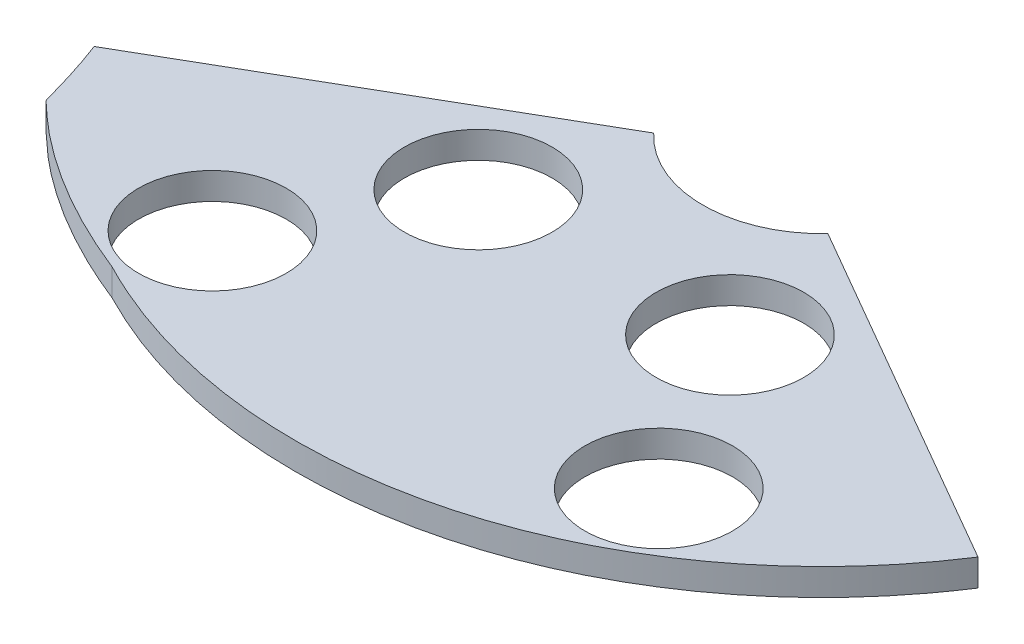
ISO-10303-21;
HEADER;
FILE_DESCRIPTION(('STEP AP214'),'2;1');
FILE_NAME('part.step','',(''),(''),'','','');
FILE_SCHEMA(('AUTOMOTIVE_DESIGN { 1 0 10303 214 1 1 1 1 }'));
ENDSEC;
DATA;
#1=APPLICATION_CONTEXT('core data for automotive mechanical design processes');
#2=APPLICATION_PROTOCOL_DEFINITION('international standard','automotive_design',2000,#1);
#3=PRODUCT_CONTEXT('',#1,'mechanical');
#4=PRODUCT('Part','Part','',(#3));
#5=PRODUCT_RELATED_PRODUCT_CATEGORY('part','',(#4));
#6=PRODUCT_DEFINITION_FORMATION('','',#4);
#7=PRODUCT_DEFINITION_CONTEXT('part definition',#1,'design');
#8=PRODUCT_DEFINITION('design','',#6,#7);
#9=PRODUCT_DEFINITION_SHAPE('','',#8);
#10=(LENGTH_UNIT() NAMED_UNIT(*) SI_UNIT(.MILLI.,.METRE.));
#11=(NAMED_UNIT(*) PLANE_ANGLE_UNIT() SI_UNIT($,.RADIAN.));
#12=(NAMED_UNIT(*) SI_UNIT($,.STERADIAN.) SOLID_ANGLE_UNIT());
#13=UNCERTAINTY_MEASURE_WITH_UNIT(LENGTH_MEASURE(1.E-05),#10,'distance_accuracy_value','');
#14=(GEOMETRIC_REPRESENTATION_CONTEXT(3) GLOBAL_UNCERTAINTY_ASSIGNED_CONTEXT((#13)) GLOBAL_UNIT_ASSIGNED_CONTEXT((#10,
#11,#12)) REPRESENTATION_CONTEXT('',''));
#15=CARTESIAN_POINT('',(0.,0.,0.));
#16=DIRECTION('',(0.,0.,1.));
#17=DIRECTION('',(1.,0.,0.));
#18=AXIS2_PLACEMENT_3D('',#15,#16,#17);
#19=CARTESIAN_POINT('',(0.,-123.736,0.));
#20=DIRECTION('',(0.,-1.,0.));
#21=DIRECTION('',(0.,0.,-1.));
#22=AXIS2_PLACEMENT_3D('',#19,#20,#21);
#23=PLANE('',#22);
#24=CARTESIAN_POINT('',(18.75,-123.736,32.476));
#25=DIRECTION('',(0.,-1.,0.));
#26=DIRECTION('',(0.,0.,-1.));
#27=AXIS2_PLACEMENT_3D('',#24,#25,#26);
#28=CIRCLE('',#27,10.999845998306);
#29=CARTESIAN_POINT('',(18.75,-123.736,21.476154001694));
#30=VERTEX_POINT('',#29);
#31=EDGE_CURVE('E253',#30,#30,#28,.T.);
#32=ORIENTED_EDGE('',*,*,#31,.F.);
#33=EDGE_LOOP('',(#32));
#34=FACE_BOUND('',#33,.T.);
#35=CARTESIAN_POINT('',(-33.25,-123.736,57.591));
#36=DIRECTION('',(0.,-1.,0.));
#37=DIRECTION('',(0.,0.,-1.));
#38=AXIS2_PLACEMENT_3D('',#35,#36,#37);
#39=CIRCLE('',#38,10.999845998306);
#40=CARTESIAN_POINT('',(-33.25,-123.736,46.591154001694));
#41=VERTEX_POINT('',#40);
#42=EDGE_CURVE('E160',#41,#41,#39,.T.);
#43=ORIENTED_EDGE('',*,*,#42,.F.);
#44=EDGE_LOOP('',(#43));
#45=FACE_BOUND('',#44,.T.);
#46=CARTESIAN_POINT('',(0.,-123.736,0.));
#47=DIRECTION('',(0.,1.,0.));
#48=DIRECTION('',(0.,0.,-1.));
#49=AXIS2_PLACEMENT_3D('',#46,#47,#48);
#50=CIRCLE('',#49,17.7501305084715);
#51=CARTESIAN_POINT('',(-12.9766531358799,-123.736,12.1108879302399));
#52=VERTEX_POINT('',#51);
#53=CARTESIAN_POINT('',(12.9766531358511,-123.736,12.1108879302707));
#54=VERTEX_POINT('',#53);
#55=EDGE_CURVE('E239',#52,#54,#50,.T.);
#56=ORIENTED_EDGE('',*,*,#55,.T.);
#57=DIRECTION('',(0.866025113442764,0.,0.500000502886195));
#58=VECTOR('',#57,1.);
#59=CARTESIAN_POINT('',(65.8946490574717,-123.736,42.6631480920525));
#60=LINE('',#59,#58);
#61=CARTESIAN_POINT('',(65.8946490574308,-123.736,42.6631480921157));
#62=VERTEX_POINT('',#61);
#63=EDGE_CURVE('E87',#54,#62,#60,.T.);
#64=ORIENTED_EDGE('',*,*,#63,.T.);
#65=CARTESIAN_POINT('',(-36.0665229319562,-123.736,69.7244372290524));
#66=CARTESIAN_POINT('',(-33.9263651647382,-123.736,70.8313229064624));
#67=CARTESIAN_POINT('',(-31.733770481213,-123.736,71.8398511649839));
#68=CARTESIAN_POINT('',(-27.2665982878309,-123.736,73.6519320144781));
#69=CARTESIAN_POINT('',(-24.9926269144818,-123.736,74.454603747582));
#70=CARTESIAN_POINT('',(-18.0716834468872,-123.736,76.5431271317146));
#71=CARTESIAN_POINT('',(-13.3281026231671,-123.736,77.5101685655605));
#72=CARTESIAN_POINT('',(-3.7462840567191,-123.736,78.5578587223858));
#73=CARTESIAN_POINT('',(1.09488051094354,-123.736,78.6398270020589));
#74=CARTESIAN_POINT('',(10.7057445200637,-123.736,77.9159109696359));
#75=CARTESIAN_POINT('',(15.4790771875439,-123.736,77.109522932305));
#76=CARTESIAN_POINT('',(24.7961822535566,-123.736,74.6368043425033));
#77=CARTESIAN_POINT('',(29.3418059334004,-123.736,72.9708446557198));
#78=CARTESIAN_POINT('',(35.8688225975578,-123.736,69.8675464746013));
#79=CARTESIAN_POINT('',(37.9990277904272,-123.736,68.7312628611845));
#80=CARTESIAN_POINT('',(42.1449660264491,-123.736,66.2711436137321));
#81=CARTESIAN_POINT('',(44.1586593832447,-123.736,64.9468560352647));
#82=CARTESIAN_POINT('',(50.009545434694,-123.736,60.6985787520622));
#83=CARTESIAN_POINT('',(53.6504488776382,-123.736,57.5081549449506));
#84=CARTESIAN_POINT('',(60.2830922387752,-123.736,50.513430512781));
#85=CARTESIAN_POINT('',(63.2752407093175,-123.736,46.7092688759202));
#86=CARTESIAN_POINT('',(65.8946490574308,-123.736,42.6631480921158));
#87=B_SPLINE_CURVE_WITH_KNOTS('',3,(#65,#66,#67,#68,#69,#70,#71,#72,#73,#74,#75,#76,#77,#78,#79,
#80,#81,#82,#83,#84,#85,#86),.UNSPECIFIED.,.F.,.F.,(4,2,2,2,2,2,2,2,2,2,4),
(6.50812737035267E-13,0.062503262884923,0.125003262884923,0.250003262884923,0.375003262884923,
0.500003262884923,0.625003262884923,0.687503262884923,0.750003262884923,0.875003262884923,
1.00000326288427),.UNSPECIFIED.);
#88=CARTESIAN_POINT('',(-36.0665229320546,-123.736,69.7244372290044));
#89=VERTEX_POINT('',#88);
#90=EDGE_CURVE('E102',#62,#89,#87,.F.);
#91=ORIENTED_EDGE('',*,*,#90,.T.);
#92=CARTESIAN_POINT('',(-62.4468616583492,-123.736,53.185552447563));
#93=CARTESIAN_POINT('',(-61.4901393919054,-123.736,54.0794734803377));
#94=CARTESIAN_POINT('',(-60.5319988250484,-123.736,54.9714544159299));
#95=CARTESIAN_POINT('',(-58.577666442625,-123.736,56.7033640663195));
#96=CARTESIAN_POINT('',(-57.5709386968218,-123.736,57.5288802486669));
#97=CARTESIAN_POINT('',(-55.5066131007295,-123.736,59.1103250015006));
#98=CARTESIAN_POINT('',(-54.4533348312587,-123.736,59.8721625300366));
#99=CARTESIAN_POINT('',(-52.3116487255476,-123.736,61.3477821981544));
#100=CARTESIAN_POINT('',(-51.2212392950185,-123.736,62.0588262626355));
#101=CARTESIAN_POINT('',(-47.8899237802097,-123.736,64.1097623133816));
#102=CARTESIAN_POINT('',(-45.586739354902,-123.736,65.3746470110569));
#103=CARTESIAN_POINT('',(-40.8950481343327,-123.736,67.6957331646374));
#104=CARTESIAN_POINT('',(-38.5017313996717,-123.736,68.7547962660256));
#105=CARTESIAN_POINT('',(-36.0665229320545,-123.736,69.7244372290044));
#106=B_SPLINE_CURVE_WITH_KNOTS('',3,(#92,#93,#94,#95,#96,#97,#98,#99,#100,#101,#102,#103,#104,
#105),.UNSPECIFIED.,.F.,.F.,(4,2,2,2,2,2,4),(1.2002171197345E-05,0.125012002171197,
0.250012002171197,0.375012002171197,0.500012002171197,0.750012002171197,1.),.UNSPECIFIED.);
#107=CARTESIAN_POINT('',(-62.4468616218787,-123.736,53.1855525231798));
#108=VERTEX_POINT('',#107);
#109=EDGE_CURVE('E94',#89,#108,#106,.F.);
#110=ORIENTED_EDGE('',*,*,#109,.T.);
#111=CARTESIAN_POINT('',(-65.8287354386624,-123.736,42.6250965336986));
#112=CARTESIAN_POINT('',(-64.5122253320953,-123.736,46.0815526946809));
#113=CARTESIAN_POINT('',(-63.4279378526957,-123.736,49.6198971871584));
#114=CARTESIAN_POINT('',(-62.4468616218787,-123.736,53.1855525231798));
#115=B_SPLINE_CURVE_WITH_KNOTS('',3,(#111,#112,#113,#114),.UNSPECIFIED.,.F.,.F.,(4,4),(0.,1.),.UNSPECIFIED.);
#116=CARTESIAN_POINT('',(-65.8287354386624,-123.736,42.6250965336986));
#117=VERTEX_POINT('',#116);
#118=EDGE_CURVE('E99',#108,#117,#115,.F.);
#119=ORIENTED_EDGE('',*,*,#118,.T.);
#120=DIRECTION('',(0.866025086918566,0.,-0.50000054882739));
#121=VECTOR('',#120,1.);
#122=CARTESIAN_POINT('',(-12.9766531358799,-123.736,12.1108879302399));
#123=LINE('',#122,#121);
#124=EDGE_CURVE('E49',#117,#52,#123,.T.);
#125=ORIENTED_EDGE('',*,*,#124,.T.);
#126=EDGE_LOOP('',(#56,#64,#91,#110,#119,#125));
#127=FACE_BOUND('',#126,.T.);
#128=CARTESIAN_POINT('',(33.25,-123.736,57.591));
#129=DIRECTION('',(0.,-1.,0.));
#130=DIRECTION('',(0.,0.,-1.));
#131=AXIS2_PLACEMENT_3D('',#128,#129,#130);
#132=CIRCLE('',#131,10.999845998306);
#133=CARTESIAN_POINT('',(33.25,-123.736,46.591154001694));
#134=VERTEX_POINT('',#133);
#135=EDGE_CURVE('E247',#134,#134,#132,.T.);
#136=ORIENTED_EDGE('',*,*,#135,.F.);
#137=EDGE_LOOP('',(#136));
#138=FACE_BOUND('',#137,.T.);
#139=CARTESIAN_POINT('',(-18.75,-123.736,32.476));
#140=DIRECTION('',(0.,-1.,0.));
#141=DIRECTION('',(0.,0.,-1.));
#142=AXIS2_PLACEMENT_3D('',#139,#140,#141);
#143=CIRCLE('',#142,10.999845998306);
#144=CARTESIAN_POINT('',(-18.75,-123.736,21.476154001694));
#145=VERTEX_POINT('',#144);
#146=EDGE_CURVE('E259',#145,#145,#143,.T.);
#147=ORIENTED_EDGE('',*,*,#146,.F.);
#148=EDGE_LOOP('',(#147));
#149=FACE_BOUND('',#148,.T.);
#150=ADVANCED_FACE('F30',(#34,#45,#127,#138,#149),#23,.T.);
#151=CARTESIAN_POINT('',(0.,-119.736,0.));
#152=DIRECTION('',(0.,-1.,0.));
#153=DIRECTION('',(0.,0.,-1.));
#154=AXIS2_PLACEMENT_3D('',#151,#152,#153);
#155=PLANE('',#154);
#156=CARTESIAN_POINT('',(18.75,-119.736,32.476));
#157=DIRECTION('',(0.,-1.,0.));
#158=DIRECTION('',(0.,0.,-1.));
#159=AXIS2_PLACEMENT_3D('',#156,#157,#158);
#160=CIRCLE('',#159,10.999845998306);
#161=CARTESIAN_POINT('',(18.75,-119.736,21.476154001694));
#162=VERTEX_POINT('',#161);
#163=EDGE_CURVE('E256',#162,#162,#160,.T.);
#164=ORIENTED_EDGE('',*,*,#163,.T.);
#165=EDGE_LOOP('',(#164));
#166=FACE_BOUND('',#165,.T.);
#167=CARTESIAN_POINT('',(-33.25,-119.736,57.591));
#168=DIRECTION('',(0.,-1.,0.));
#169=DIRECTION('',(0.,0.,-1.));
#170=AXIS2_PLACEMENT_3D('',#167,#168,#169);
#171=CIRCLE('',#170,10.999845998306);
#172=CARTESIAN_POINT('',(-33.25,-119.736,46.591154001694));
#173=VERTEX_POINT('',#172);
#174=EDGE_CURVE('E244',#173,#173,#171,.T.);
#175=ORIENTED_EDGE('',*,*,#174,.T.);
#176=EDGE_LOOP('',(#175));
#177=FACE_BOUND('',#176,.T.);
#178=CARTESIAN_POINT('',(0.,-119.736,0.));
#179=DIRECTION('',(0.,1.,0.));
#180=DIRECTION('',(0.,0.,-1.));
#181=AXIS2_PLACEMENT_3D('',#178,#179,#180);
#182=CIRCLE('',#181,17.7501305084715);
#183=CARTESIAN_POINT('',(-12.9766531358799,-119.736,12.1108879302399));
#184=VERTEX_POINT('',#183);
#185=CARTESIAN_POINT('',(12.9766531358511,-119.736,12.1108879302707));
#186=VERTEX_POINT('',#185);
#187=EDGE_CURVE('E153',#184,#186,#182,.T.);
#188=ORIENTED_EDGE('',*,*,#187,.F.);
#189=DIRECTION('',(0.866025086918566,0.,-0.50000054882739));
#190=VECTOR('',#189,1.);
#191=CARTESIAN_POINT('',(-12.9766531358799,-119.736,12.1108879302399));
#192=LINE('',#191,#190);
#193=CARTESIAN_POINT('',(-65.8287354386624,-119.736,42.6250965336986));
#194=VERTEX_POINT('',#193);
#195=EDGE_CURVE('E79',#194,#184,#192,.T.);
#196=ORIENTED_EDGE('',*,*,#195,.F.);
#197=CARTESIAN_POINT('',(-62.4468616218787,-119.736,53.1855525231798));
#198=CARTESIAN_POINT('',(-63.4279378526957,-119.736,49.6198971871584));
#199=CARTESIAN_POINT('',(-64.5122253320953,-119.736,46.0815526946809));
#200=CARTESIAN_POINT('',(-65.8287354386624,-119.736,42.6250965336986));
#201=B_SPLINE_CURVE_WITH_KNOTS('',3,(#197,#198,#199,#200),.UNSPECIFIED.,.F.,.F.,(4,4),(0.,1.),.UNSPECIFIED.);
#202=CARTESIAN_POINT('',(-62.4468616218787,-119.736,53.1855525231798));
#203=VERTEX_POINT('',#202);
#204=EDGE_CURVE('E72',#203,#194,#201,.T.);
#205=ORIENTED_EDGE('',*,*,#204,.F.);
#206=CARTESIAN_POINT('',(-36.0665229320545,-119.736,69.7244372290044));
#207=CARTESIAN_POINT('',(-38.5017313996717,-119.736,68.7547962660256));
#208=CARTESIAN_POINT('',(-40.8950481343327,-119.736,67.6957331646374));
#209=CARTESIAN_POINT('',(-45.586739354902,-119.736,65.3746470110569));
#210=CARTESIAN_POINT('',(-47.8899237802097,-119.736,64.1097623133816));
#211=CARTESIAN_POINT('',(-51.2212392950185,-119.736,62.0588262626355));
#212=CARTESIAN_POINT('',(-52.3116487255476,-119.736,61.3477821981544));
#213=CARTESIAN_POINT('',(-54.4533348312587,-119.736,59.8721625300366));
#214=CARTESIAN_POINT('',(-55.5066131007295,-119.736,59.1103250015006));
#215=CARTESIAN_POINT('',(-57.5709386968218,-119.736,57.5288802486669));
#216=CARTESIAN_POINT('',(-58.577666442625,-119.736,56.7033640663195));
#217=CARTESIAN_POINT('',(-60.5319988250484,-119.736,54.9714544159299));
#218=CARTESIAN_POINT('',(-61.4901393919054,-119.736,54.0794734803377));
#219=CARTESIAN_POINT('',(-62.4468616583492,-119.736,53.185552447563));
#220=B_SPLINE_CURVE_WITH_KNOTS('',3,(#206,#207,#208,#209,#210,#211,#212,#213,#214,#215,#216,
#217,#218,#219),.UNSPECIFIED.,.F.,.F.,(4,2,2,2,2,2,4),(1.20021711972371E-05,0.25,0.5,0.625,0.75,
0.875,1.),.UNSPECIFIED.);
#221=CARTESIAN_POINT('',(-36.0665229320546,-119.736,69.7244372290044));
#222=VERTEX_POINT('',#221);
#223=EDGE_CURVE('E113',#222,#203,#220,.T.);
#224=ORIENTED_EDGE('',*,*,#223,.F.);
#225=CARTESIAN_POINT('',(65.8946490574308,-119.736,42.6631480921158));
#226=CARTESIAN_POINT('',(63.2752407093175,-119.736,46.7092688759202));
#227=CARTESIAN_POINT('',(60.2830922387752,-119.736,50.513430512781));
#228=CARTESIAN_POINT('',(53.6504488776382,-119.736,57.5081549449506));
#229=CARTESIAN_POINT('',(50.009545434694,-119.736,60.6985787520622));
#230=CARTESIAN_POINT('',(44.1586593832447,-119.736,64.9468560352647));
#231=CARTESIAN_POINT('',(42.1449660264491,-119.736,66.2711436137321));
#232=CARTESIAN_POINT('',(37.9990277904272,-119.736,68.7312628611845));
#233=CARTESIAN_POINT('',(35.8688225975578,-119.736,69.8675464746013));
#234=CARTESIAN_POINT('',(29.3418059334004,-119.736,72.9708446557198));
#235=CARTESIAN_POINT('',(24.7961822535566,-119.736,74.6368043425033));
#236=CARTESIAN_POINT('',(15.4790771875439,-119.736,77.109522932305));
#237=CARTESIAN_POINT('',(10.7057445200637,-119.736,77.9159109696359));
#238=CARTESIAN_POINT('',(1.09488051094354,-119.736,78.6398270020589));
#239=CARTESIAN_POINT('',(-3.7462840567191,-119.736,78.5578587223858));
#240=CARTESIAN_POINT('',(-13.3281026231671,-119.736,77.5101685655605));
#241=CARTESIAN_POINT('',(-18.0716834468872,-119.736,76.5431271317146));
#242=CARTESIAN_POINT('',(-24.9926269144818,-119.736,74.454603747582));
#243=CARTESIAN_POINT('',(-27.2665982878309,-119.736,73.6519320144781));
#244=CARTESIAN_POINT('',(-31.733770481213,-119.736,71.8398511649839));
#245=CARTESIAN_POINT('',(-33.9263651647382,-119.736,70.8313229064624));
#246=CARTESIAN_POINT('',(-36.0665229319562,-119.736,69.7244372290524));
#247=B_SPLINE_CURVE_WITH_KNOTS('',3,(#225,#226,#227,#228,#229,#230,#231,#232,#233,#234,#235,
#236,#237,#238,#239,#240,#241,#242,#243,#244,#245,#246),.UNSPECIFIED.,.F.,.F.,(4,2,2,2,2,2,2,2,
2,2,4),(6.50855582926839E-13,0.125,0.249999999999999,0.312499999999999,0.375,0.5,0.625,0.75,
0.875,0.9375,1.00000326288427),.UNSPECIFIED.);
#248=CARTESIAN_POINT('',(65.8946490574308,-119.736,42.6631480921157));
#249=VERTEX_POINT('',#248);
#250=EDGE_CURVE('E376',#249,#222,#247,.T.);
#251=ORIENTED_EDGE('',*,*,#250,.F.);
#252=DIRECTION('',(0.866025113442764,0.,0.500000502886195));
#253=VECTOR('',#252,1.);
#254=CARTESIAN_POINT('',(65.8946490574717,-119.736,42.6631480920525));
#255=LINE('',#254,#253);
#256=EDGE_CURVE('E159',#186,#249,#255,.T.);
#257=ORIENTED_EDGE('',*,*,#256,.F.);
#258=EDGE_LOOP('',(#188,#196,#205,#224,#251,#257));
#259=FACE_BOUND('',#258,.T.);
#260=CARTESIAN_POINT('',(33.25,-119.736,57.591));
#261=DIRECTION('',(0.,-1.,0.));
#262=DIRECTION('',(0.,0.,-1.));
#263=AXIS2_PLACEMENT_3D('',#260,#261,#262);
#264=CIRCLE('',#263,10.999845998306);
#265=CARTESIAN_POINT('',(33.25,-119.736,46.591154001694));
#266=VERTEX_POINT('',#265);
#267=EDGE_CURVE('E250',#266,#266,#264,.T.);
#268=ORIENTED_EDGE('',*,*,#267,.T.);
#269=EDGE_LOOP('',(#268));
#270=FACE_BOUND('',#269,.T.);
#271=CARTESIAN_POINT('',(-18.75,-119.736,32.476));
#272=DIRECTION('',(0.,-1.,0.));
#273=DIRECTION('',(0.,0.,-1.));
#274=AXIS2_PLACEMENT_3D('',#271,#272,#273);
#275=CIRCLE('',#274,10.999845998306);
#276=CARTESIAN_POINT('',(-18.75,-119.736,21.476154001694));
#277=VERTEX_POINT('',#276);
#278=EDGE_CURVE('E262',#277,#277,#275,.T.);
#279=ORIENTED_EDGE('',*,*,#278,.T.);
#280=EDGE_LOOP('',(#279));
#281=FACE_BOUND('',#280,.T.);
#282=ADVANCED_FACE('F185',(#166,#177,#259,#270,#281),#155,.F.);
#283=CARTESIAN_POINT('',(0.,-123.736,0.));
#284=DIRECTION('',(0.,1.,0.));
#285=DIRECTION('',(0.,0.,1.));
#286=AXIS2_PLACEMENT_3D('',#283,#284,#285);
#287=CYLINDRICAL_SURFACE('',#286,17.7501305084715);
#288=ORIENTED_EDGE('',*,*,#187,.T.);
#289=DIRECTION('',(0.,1.,0.));
#290=VECTOR('',#289,1.);
#291=CARTESIAN_POINT('',(12.9766531358511,-123.736,12.1108879302707));
#292=LINE('',#291,#290);
#293=EDGE_CURVE('E11',#54,#186,#292,.T.);
#294=ORIENTED_EDGE('',*,*,#293,.F.);
#295=ORIENTED_EDGE('',*,*,#55,.F.);
#296=DIRECTION('',(0.,1.,0.));
#297=VECTOR('',#296,1.);
#298=CARTESIAN_POINT('',(-12.9766531358799,-123.736,12.1108879302399));
#299=LINE('',#298,#297);
#300=EDGE_CURVE('E161',#52,#184,#299,.T.);
#301=ORIENTED_EDGE('',*,*,#300,.T.);
#302=EDGE_LOOP('',(#288,#294,#295,#301));
#303=FACE_BOUND('',#302,.T.);
#304=ADVANCED_FACE('F32',(#303),#287,.F.);
#305=CARTESIAN_POINT('',(65.8946490574717,-123.736,42.6631480920525));
#306=DIRECTION('',(-0.500000502886195,0.,0.866025113442764));
#307=DIRECTION('',(0.866025113442764,0.,0.500000502886195));
#308=AXIS2_PLACEMENT_3D('',#305,#306,#307);
#309=PLANE('',#308);
#310=ORIENTED_EDGE('',*,*,#256,.T.);
#311=DIRECTION('',(0.,1.,0.));
#312=VECTOR('',#311,1.);
#313=CARTESIAN_POINT('',(65.8946490574308,-123.736,42.6631480921157));
#314=LINE('',#313,#312);
#315=EDGE_CURVE('E40',#62,#249,#314,.T.);
#316=ORIENTED_EDGE('',*,*,#315,.F.);
#317=ORIENTED_EDGE('',*,*,#63,.F.);
#318=ORIENTED_EDGE('',*,*,#293,.T.);
#319=EDGE_LOOP('',(#310,#316,#317,#318));
#320=FACE_BOUND('',#319,.T.);
#321=ADVANCED_FACE('F233',(#320),#309,.F.);
#322=CARTESIAN_POINT('',(65.8946490574308,-123.736,42.6631480921158));
#323=CARTESIAN_POINT('',(63.2752407093175,-123.736,46.7092688759202));
#324=CARTESIAN_POINT('',(60.2830922387752,-123.736,50.513430512781));
#325=CARTESIAN_POINT('',(53.6504488776382,-123.736,57.5081549449506));
#326=CARTESIAN_POINT('',(50.009545434694,-123.736,60.6985787520622));
#327=CARTESIAN_POINT('',(44.1586593832447,-123.736,64.9468560352647));
#328=CARTESIAN_POINT('',(42.1449660264491,-123.736,66.2711436137321));
#329=CARTESIAN_POINT('',(37.9990277904272,-123.736,68.7312628611845));
#330=CARTESIAN_POINT('',(35.8688225975578,-123.736,69.8675464746013));
#331=CARTESIAN_POINT('',(29.3418059334004,-123.736,72.9708446557198));
#332=CARTESIAN_POINT('',(24.7961822535566,-123.736,74.6368043425033));
#333=CARTESIAN_POINT('',(15.4790771875439,-123.736,77.109522932305));
#334=CARTESIAN_POINT('',(10.7057445200637,-123.736,77.9159109696359));
#335=CARTESIAN_POINT('',(1.09488051094354,-123.736,78.6398270020589));
#336=CARTESIAN_POINT('',(-3.7462840567191,-123.736,78.5578587223858));
#337=CARTESIAN_POINT('',(-13.3281026231671,-123.736,77.5101685655605));
#338=CARTESIAN_POINT('',(-18.0716834468872,-123.736,76.5431271317146));
#339=CARTESIAN_POINT('',(-24.9926269144818,-123.736,74.454603747582));
#340=CARTESIAN_POINT('',(-27.2665982878309,-123.736,73.6519320144781));
#341=CARTESIAN_POINT('',(-31.733770481213,-123.736,71.8398511649839));
#342=CARTESIAN_POINT('',(-33.9263651647382,-123.736,70.8313229064624));
#343=CARTESIAN_POINT('',(-36.0665229319562,-123.736,69.7244372290524));
#344=B_SPLINE_CURVE_WITH_KNOTS('',3,(#322,#323,#324,#325,#326,#327,#328,#329,#330,#331,#332,
#333,#334,#335,#336,#337,#338,#339,#340,#341,#342,#343),.UNSPECIFIED.,.F.,.F.,(4,2,2,2,2,2,2,2,
2,2,4),(6.50855582926839E-13,0.125,0.249999999999999,0.312499999999999,0.375,0.5,0.625,0.75,
0.875,0.9375,1.00000326288427),.UNSPECIFIED.);
#345=DIRECTION('',(0.,1.,0.));
#346=VECTOR('',#345,1.);
#347=SURFACE_OF_LINEAR_EXTRUSION('',#344,#346);
#348=ORIENTED_EDGE('',*,*,#250,.T.);
#349=DIRECTION('',(0.,1.,0.));
#350=VECTOR('',#349,1.);
#351=CARTESIAN_POINT('',(-36.0665229320546,-123.736,69.7244372290044));
#352=LINE('',#351,#350);
#353=EDGE_CURVE('E115',#89,#222,#352,.T.);
#354=ORIENTED_EDGE('',*,*,#353,.F.);
#355=ORIENTED_EDGE('',*,*,#90,.F.);
#356=ORIENTED_EDGE('',*,*,#315,.T.);
#357=EDGE_LOOP('',(#348,#354,#355,#356));
#358=FACE_BOUND('',#357,.T.);
#359=ADVANCED_FACE('F225',(#358),#347,.F.);
#360=CARTESIAN_POINT('',(-36.0661721814587,-123.736,69.7245768886529));
#361=CARTESIAN_POINT('',(-38.5015015885518,-123.736,68.7548979591271));
#362=CARTESIAN_POINT('',(-40.8949355106668,-123.736,67.6957888821216));
#363=CARTESIAN_POINT('',(-45.586739354902,-123.736,65.3746470110569));
#364=CARTESIAN_POINT('',(-47.8899237802097,-123.736,64.1097623133816));
#365=CARTESIAN_POINT('',(-51.2212392950185,-123.736,62.0588262626355));
#366=CARTESIAN_POINT('',(-52.3116487255476,-123.736,61.3477821981544));
#367=CARTESIAN_POINT('',(-54.4533348312587,-123.736,59.8721625300366));
#368=CARTESIAN_POINT('',(-55.5066131007295,-123.736,59.1103250015006));
#369=CARTESIAN_POINT('',(-57.5709386968218,-123.736,57.5288802486669));
#370=CARTESIAN_POINT('',(-58.577666442625,-123.736,56.7033640663195));
#371=CARTESIAN_POINT('',(-60.5319988250484,-123.736,54.9714544159299));
#372=CARTESIAN_POINT('',(-61.4901393919054,-123.736,54.0794734803377));
#373=CARTESIAN_POINT('',(-62.4468616583492,-123.736,53.185552447563));
#374=B_SPLINE_CURVE_WITH_KNOTS('',3,(#360,#361,#362,#363,#364,#365,#366,#367,#368,#369,#370,
#371,#372,#373),.UNSPECIFIED.,.F.,.F.,(4,2,2,2,2,2,4),(0.,0.25,0.5,0.625,0.75,0.875,1.),.UNSPECIFIED.);
#375=DIRECTION('',(0.,1.,0.));
#376=VECTOR('',#375,1.);
#377=SURFACE_OF_LINEAR_EXTRUSION('',#374,#376);
#378=ORIENTED_EDGE('',*,*,#223,.T.);
#379=DIRECTION('',(0.,1.,0.));
#380=VECTOR('',#379,1.);
#381=CARTESIAN_POINT('',(-62.4468616218787,-123.736,53.1855525231798));
#382=LINE('',#381,#380);
#383=EDGE_CURVE('E110',#108,#203,#382,.T.);
#384=ORIENTED_EDGE('',*,*,#383,.F.);
#385=ORIENTED_EDGE('',*,*,#109,.F.);
#386=ORIENTED_EDGE('',*,*,#353,.T.);
#387=EDGE_LOOP('',(#378,#384,#385,#386));
#388=FACE_BOUND('',#387,.T.);
#389=ADVANCED_FACE('F111',(#388),#377,.F.);
#390=CARTESIAN_POINT('',(-62.4468616218787,-123.736,53.1855525231798));
#391=CARTESIAN_POINT('',(-63.4279378526957,-123.736,49.6198971871584));
#392=CARTESIAN_POINT('',(-64.5122253320953,-123.736,46.0815526946809));
#393=CARTESIAN_POINT('',(-65.8287354386624,-123.736,42.6250965336986));
#394=B_SPLINE_CURVE_WITH_KNOTS('',3,(#390,#391,#392,#393),.UNSPECIFIED.,.F.,.F.,(4,4),(0.,1.),.UNSPECIFIED.);
#395=DIRECTION('',(0.,1.,0.));
#396=VECTOR('',#395,1.);
#397=SURFACE_OF_LINEAR_EXTRUSION('',#394,#396);
#398=ORIENTED_EDGE('',*,*,#204,.T.);
#399=DIRECTION('',(0.,1.,0.));
#400=VECTOR('',#399,1.);
#401=CARTESIAN_POINT('',(-65.8287354386624,-123.736,42.6250965336986));
#402=LINE('',#401,#400);
#403=EDGE_CURVE('E116',#117,#194,#402,.T.);
#404=ORIENTED_EDGE('',*,*,#403,.F.);
#405=ORIENTED_EDGE('',*,*,#118,.F.);
#406=ORIENTED_EDGE('',*,*,#383,.T.);
#407=EDGE_LOOP('',(#398,#404,#405,#406));
#408=FACE_BOUND('',#407,.T.);
#409=ADVANCED_FACE('F119',(#408),#397,.F.);
#410=CARTESIAN_POINT('',(-12.9766531358799,-123.736,12.1108879302399));
#411=DIRECTION('',(0.50000054882739,0.,0.866025086918566));
#412=DIRECTION('',(0.866025086918566,0.,-0.50000054882739));
#413=AXIS2_PLACEMENT_3D('',#410,#411,#412);
#414=PLANE('',#413);
#415=ORIENTED_EDGE('',*,*,#195,.T.);
#416=ORIENTED_EDGE('',*,*,#300,.F.);
#417=ORIENTED_EDGE('',*,*,#124,.F.);
#418=ORIENTED_EDGE('',*,*,#403,.T.);
#419=EDGE_LOOP('',(#415,#416,#417,#418));
#420=FACE_BOUND('',#419,.T.);
#421=ADVANCED_FACE('F139',(#420),#414,.F.);
#422=CARTESIAN_POINT('',(-33.25,-123.736,57.591));
#423=DIRECTION('',(0.,1.,0.));
#424=DIRECTION('',(0.,0.,1.));
#425=AXIS2_PLACEMENT_3D('',#422,#423,#424);
#426=CYLINDRICAL_SURFACE('',#425,10.999845998306);
#427=ORIENTED_EDGE('',*,*,#42,.T.);
#428=EDGE_LOOP('',(#427));
#429=FACE_BOUND('',#428,.T.);
#430=ORIENTED_EDGE('',*,*,#174,.F.);
#431=EDGE_LOOP('',(#430));
#432=FACE_BOUND('',#431,.T.);
#433=ADVANCED_FACE('F279',(#429,#432),#426,.F.);
#434=CARTESIAN_POINT('',(33.25,-123.736,57.591));
#435=DIRECTION('',(0.,1.,0.));
#436=DIRECTION('',(0.,0.,1.));
#437=AXIS2_PLACEMENT_3D('',#434,#435,#436);
#438=CYLINDRICAL_SURFACE('',#437,10.999845998306);
#439=ORIENTED_EDGE('',*,*,#135,.T.);
#440=EDGE_LOOP('',(#439));
#441=FACE_BOUND('',#440,.T.);
#442=ORIENTED_EDGE('',*,*,#267,.F.);
#443=EDGE_LOOP('',(#442));
#444=FACE_BOUND('',#443,.T.);
#445=ADVANCED_FACE('F282',(#441,#444),#438,.F.);
#446=CARTESIAN_POINT('',(18.75,-123.736,32.476));
#447=DIRECTION('',(0.,1.,0.));
#448=DIRECTION('',(0.,0.,1.));
#449=AXIS2_PLACEMENT_3D('',#446,#447,#448);
#450=CYLINDRICAL_SURFACE('',#449,10.999845998306);
#451=ORIENTED_EDGE('',*,*,#31,.T.);
#452=EDGE_LOOP('',(#451));
#453=FACE_BOUND('',#452,.T.);
#454=ORIENTED_EDGE('',*,*,#163,.F.);
#455=EDGE_LOOP('',(#454));
#456=FACE_BOUND('',#455,.T.);
#457=ADVANCED_FACE('F290',(#453,#456),#450,.F.);
#458=CARTESIAN_POINT('',(-18.75,-123.736,32.476));
#459=DIRECTION('',(0.,1.,0.));
#460=DIRECTION('',(0.,0.,1.));
#461=AXIS2_PLACEMENT_3D('',#458,#459,#460);
#462=CYLINDRICAL_SURFACE('',#461,10.999845998306);
#463=ORIENTED_EDGE('',*,*,#146,.T.);
#464=EDGE_LOOP('',(#463));
#465=FACE_BOUND('',#464,.T.);
#466=ORIENTED_EDGE('',*,*,#278,.F.);
#467=EDGE_LOOP('',(#466));
#468=FACE_BOUND('',#467,.T.);
#469=ADVANCED_FACE('F268',(#465,#468),#462,.F.);
#470=CLOSED_SHELL('',(#150,#282,#304,#321,#359,#389,#409,#421,#433,#445,#457,#469));
#471=MANIFOLD_SOLID_BREP('B2',#470);
#472=ADVANCED_BREP_SHAPE_REPRESENTATION('',(#18,#471),#14);
#473=SHAPE_DEFINITION_REPRESENTATION(#9,#472);
ENDSEC;
END-ISO-10303-21;
